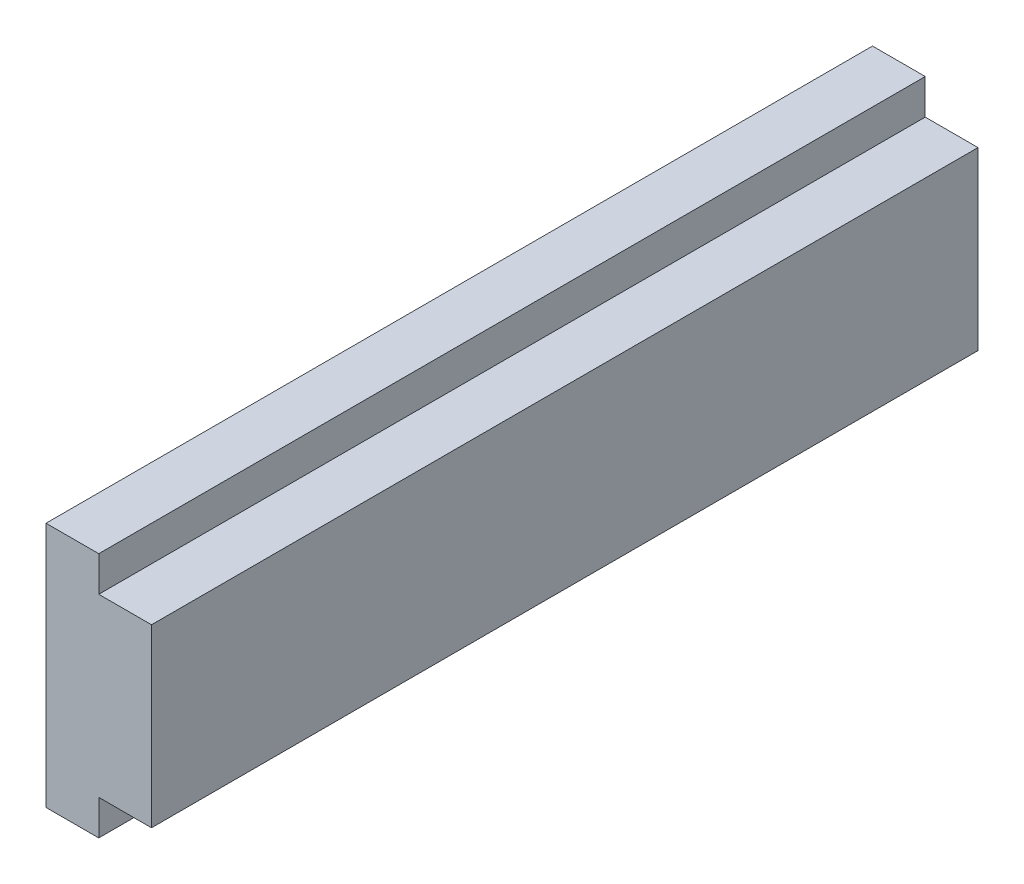
ISO-10303-21;
HEADER;
FILE_DESCRIPTION(('STEP AP214'),'2;1');
FILE_NAME('part.step','',(''),(''),'','','');
FILE_SCHEMA(('AUTOMOTIVE_DESIGN { 1 0 10303 214 1 1 1 1 }'));
ENDSEC;
DATA;
#1=APPLICATION_CONTEXT('core data for automotive mechanical design processes');
#2=APPLICATION_PROTOCOL_DEFINITION('international standard','automotive_design',2000,#1);
#3=PRODUCT_CONTEXT('',#1,'mechanical');
#4=PRODUCT('Part','Part','',(#3));
#5=PRODUCT_RELATED_PRODUCT_CATEGORY('part','',(#4));
#6=PRODUCT_DEFINITION_FORMATION('','',#4);
#7=PRODUCT_DEFINITION_CONTEXT('part definition',#1,'design');
#8=PRODUCT_DEFINITION('design','',#6,#7);
#9=PRODUCT_DEFINITION_SHAPE('','',#8);
#10=(LENGTH_UNIT() NAMED_UNIT(*) SI_UNIT(.MILLI.,.METRE.));
#11=(NAMED_UNIT(*) PLANE_ANGLE_UNIT() SI_UNIT($,.RADIAN.));
#12=(NAMED_UNIT(*) SI_UNIT($,.STERADIAN.) SOLID_ANGLE_UNIT());
#13=UNCERTAINTY_MEASURE_WITH_UNIT(LENGTH_MEASURE(1.E-05),#10,'distance_accuracy_value','');
#14=(GEOMETRIC_REPRESENTATION_CONTEXT(3) GLOBAL_UNCERTAINTY_ASSIGNED_CONTEXT((#13)) GLOBAL_UNIT_ASSIGNED_CONTEXT((#10,
#11,#12)) REPRESENTATION_CONTEXT('',''));
#15=CARTESIAN_POINT('',(0.,0.,0.));
#16=DIRECTION('',(0.,0.,1.));
#17=DIRECTION('',(1.,0.,0.));
#18=AXIS2_PLACEMENT_3D('',#15,#16,#17);
#19=CARTESIAN_POINT('',(0.,0.,47.));
#20=DIRECTION('',(0.,1.,0.));
#21=DIRECTION('',(0.,0.,1.));
#22=AXIS2_PLACEMENT_3D('',#19,#20,#21);
#23=PLANE('',#22);
#24=DIRECTION('',(1.,0.,0.));
#25=VECTOR('',#24,1.);
#26=CARTESIAN_POINT('',(0.,0.,0.));
#27=LINE('',#26,#25);
#28=CARTESIAN_POINT('',(0.,0.,0.));
#29=VERTEX_POINT('',#28);
#30=CARTESIAN_POINT('',(3.,0.,0.));
#31=VERTEX_POINT('',#30);
#32=EDGE_CURVE('E144',#29,#31,#27,.T.);
#33=ORIENTED_EDGE('',*,*,#32,.T.);
#34=DIRECTION('',(0.,0.,-1.));
#35=VECTOR('',#34,1.);
#36=CARTESIAN_POINT('',(3.,0.,47.));
#37=LINE('',#36,#35);
#38=CARTESIAN_POINT('',(3.,0.,47.));
#39=VERTEX_POINT('',#38);
#40=EDGE_CURVE('E11',#39,#31,#37,.T.);
#41=ORIENTED_EDGE('',*,*,#40,.F.);
#42=DIRECTION('',(1.,0.,0.));
#43=VECTOR('',#42,1.);
#44=CARTESIAN_POINT('',(0.,0.,47.));
#45=LINE('',#44,#43);
#46=CARTESIAN_POINT('',(0.,0.,47.));
#47=VERTEX_POINT('',#46);
#48=EDGE_CURVE('E169',#47,#39,#45,.T.);
#49=ORIENTED_EDGE('',*,*,#48,.F.);
#50=DIRECTION('',(0.,0.,-1.));
#51=VECTOR('',#50,1.);
#52=CARTESIAN_POINT('',(0.,0.,47.));
#53=LINE('',#52,#51);
#54=EDGE_CURVE('E58',#47,#29,#53,.T.);
#55=ORIENTED_EDGE('',*,*,#54,.T.);
#56=EDGE_LOOP('',(#33,#41,#49,#55));
#57=FACE_BOUND('',#56,.T.);
#58=ADVANCED_FACE('F41',(#57),#23,.F.);
#59=CARTESIAN_POINT('',(3.,0.,47.));
#60=DIRECTION('',(-1.,0.,0.));
#61=DIRECTION('',(0.,0.,1.));
#62=AXIS2_PLACEMENT_3D('',#59,#60,#61);
#63=PLANE('',#62);
#64=DIRECTION('',(0.,1.,0.));
#65=VECTOR('',#64,1.);
#66=CARTESIAN_POINT('',(3.,0.,0.));
#67=LINE('',#66,#65);
#68=CARTESIAN_POINT('',(3.,2.,0.));
#69=VERTEX_POINT('',#68);
#70=EDGE_CURVE('E147',#31,#69,#67,.T.);
#71=ORIENTED_EDGE('',*,*,#70,.T.);
#72=DIRECTION('',(0.,0.,-1.));
#73=VECTOR('',#72,1.);
#74=CARTESIAN_POINT('',(3.,2.,47.));
#75=LINE('',#74,#73);
#76=CARTESIAN_POINT('',(3.,2.,47.));
#77=VERTEX_POINT('',#76);
#78=EDGE_CURVE('E50',#77,#69,#75,.T.);
#79=ORIENTED_EDGE('',*,*,#78,.F.);
#80=DIRECTION('',(0.,1.,0.));
#81=VECTOR('',#80,1.);
#82=CARTESIAN_POINT('',(3.,0.,47.));
#83=LINE('',#82,#81);
#84=EDGE_CURVE('E96',#39,#77,#83,.T.);
#85=ORIENTED_EDGE('',*,*,#84,.F.);
#86=ORIENTED_EDGE('',*,*,#40,.T.);
#87=EDGE_LOOP('',(#71,#79,#85,#86));
#88=FACE_BOUND('',#87,.T.);
#89=ADVANCED_FACE('F205',(#88),#63,.F.);
#90=CARTESIAN_POINT('',(0.,2.,47.));
#91=DIRECTION('',(0.,1.,0.));
#92=DIRECTION('',(0.,0.,1.));
#93=AXIS2_PLACEMENT_3D('',#90,#91,#92);
#94=PLANE('',#93);
#95=DIRECTION('',(1.,0.,0.));
#96=VECTOR('',#95,1.);
#97=CARTESIAN_POINT('',(0.,2.,0.));
#98=LINE('',#97,#96);
#99=CARTESIAN_POINT('',(6.,2.,0.));
#100=VERTEX_POINT('',#99);
#101=EDGE_CURVE('E150',#69,#100,#98,.T.);
#102=ORIENTED_EDGE('',*,*,#101,.T.);
#103=DIRECTION('',(0.,0.,-1.));
#104=VECTOR('',#103,1.);
#105=CARTESIAN_POINT('',(6.,2.,47.));
#106=LINE('',#105,#104);
#107=CARTESIAN_POINT('',(6.,2.,47.));
#108=VERTEX_POINT('',#107);
#109=EDGE_CURVE('E179',#108,#100,#106,.T.);
#110=ORIENTED_EDGE('',*,*,#109,.F.);
#111=DIRECTION('',(1.,0.,0.));
#112=VECTOR('',#111,1.);
#113=CARTESIAN_POINT('',(0.,2.,47.));
#114=LINE('',#113,#112);
#115=EDGE_CURVE('E188',#77,#108,#114,.T.);
#116=ORIENTED_EDGE('',*,*,#115,.F.);
#117=ORIENTED_EDGE('',*,*,#78,.T.);
#118=EDGE_LOOP('',(#102,#110,#116,#117));
#119=FACE_BOUND('',#118,.T.);
#120=ADVANCED_FACE('F186',(#119),#94,.F.);
#121=CARTESIAN_POINT('',(6.,0.,47.));
#122=DIRECTION('',(1.,0.,0.));
#123=DIRECTION('',(0.,1.,0.));
#124=AXIS2_PLACEMENT_3D('',#121,#122,#123);
#125=PLANE('',#124);
#126=DIRECTION('',(0.,-1.,0.));
#127=VECTOR('',#126,1.);
#128=CARTESIAN_POINT('',(6.,0.,0.));
#129=LINE('',#128,#127);
#130=CARTESIAN_POINT('',(6.,12.,0.));
#131=VERTEX_POINT('',#130);
#132=EDGE_CURVE('E154',#131,#100,#129,.T.);
#133=ORIENTED_EDGE('',*,*,#132,.F.);
#134=DIRECTION('',(0.,0.,-1.));
#135=VECTOR('',#134,1.);
#136=CARTESIAN_POINT('',(6.,12.,47.));
#137=LINE('',#136,#135);
#138=CARTESIAN_POINT('',(6.,12.,47.));
#139=VERTEX_POINT('',#138);
#140=EDGE_CURVE('E176',#139,#131,#137,.T.);
#141=ORIENTED_EDGE('',*,*,#140,.F.);
#142=DIRECTION('',(0.,-1.,0.));
#143=VECTOR('',#142,1.);
#144=CARTESIAN_POINT('',(6.,0.,47.));
#145=LINE('',#144,#143);
#146=EDGE_CURVE('E196',#139,#108,#145,.T.);
#147=ORIENTED_EDGE('',*,*,#146,.T.);
#148=ORIENTED_EDGE('',*,*,#109,.T.);
#149=EDGE_LOOP('',(#133,#141,#147,#148));
#150=FACE_BOUND('',#149,.T.);
#151=ADVANCED_FACE('F194',(#150),#125,.T.);
#152=CARTESIAN_POINT('',(0.,12.,47.));
#153=DIRECTION('',(0.,1.,0.));
#154=DIRECTION('',(0.,0.,1.));
#155=AXIS2_PLACEMENT_3D('',#152,#153,#154);
#156=PLANE('',#155);
#157=DIRECTION('',(1.,0.,0.));
#158=VECTOR('',#157,1.);
#159=CARTESIAN_POINT('',(0.,12.,0.));
#160=LINE('',#159,#158);
#161=CARTESIAN_POINT('',(3.,12.,0.));
#162=VERTEX_POINT('',#161);
#163=EDGE_CURVE('E158',#162,#131,#160,.T.);
#164=ORIENTED_EDGE('',*,*,#163,.F.);
#165=DIRECTION('',(0.,0.,-1.));
#166=VECTOR('',#165,1.);
#167=CARTESIAN_POINT('',(3.,12.,47.));
#168=LINE('',#167,#166);
#169=CARTESIAN_POINT('',(3.,12.,47.));
#170=VERTEX_POINT('',#169);
#171=EDGE_CURVE('E133',#170,#162,#168,.T.);
#172=ORIENTED_EDGE('',*,*,#171,.F.);
#173=DIRECTION('',(1.,0.,0.));
#174=VECTOR('',#173,1.);
#175=CARTESIAN_POINT('',(0.,12.,47.));
#176=LINE('',#175,#174);
#177=EDGE_CURVE('E121',#170,#139,#176,.T.);
#178=ORIENTED_EDGE('',*,*,#177,.T.);
#179=ORIENTED_EDGE('',*,*,#140,.T.);
#180=EDGE_LOOP('',(#164,#172,#178,#179));
#181=FACE_BOUND('',#180,.T.);
#182=ADVANCED_FACE('F215',(#181),#156,.T.);
#183=CARTESIAN_POINT('',(3.,14.,0.));
#184=VERTEX_POINT('',#183);
#185=EDGE_CURVE('E129',#162,#184,#67,.T.);
#186=ORIENTED_EDGE('',*,*,#185,.T.);
#187=DIRECTION('',(0.,0.,-1.));
#188=VECTOR('',#187,1.);
#189=CARTESIAN_POINT('',(3.,14.,47.));
#190=LINE('',#189,#188);
#191=CARTESIAN_POINT('',(3.,14.,47.));
#192=VERTEX_POINT('',#191);
#193=EDGE_CURVE('E126',#192,#184,#190,.T.);
#194=ORIENTED_EDGE('',*,*,#193,.F.);
#195=EDGE_CURVE('E113',#170,#192,#83,.T.);
#196=ORIENTED_EDGE('',*,*,#195,.F.);
#197=ORIENTED_EDGE('',*,*,#171,.T.);
#198=EDGE_LOOP('',(#186,#194,#196,#197));
#199=FACE_BOUND('',#198,.T.);
#200=ADVANCED_FACE('F127',(#199),#63,.F.);
#201=CARTESIAN_POINT('',(0.,14.,47.));
#202=DIRECTION('',(0.,1.,0.));
#203=DIRECTION('',(0.,0.,1.));
#204=AXIS2_PLACEMENT_3D('',#201,#202,#203);
#205=PLANE('',#204);
#206=DIRECTION('',(1.,0.,0.));
#207=VECTOR('',#206,1.);
#208=CARTESIAN_POINT('',(0.,14.,0.));
#209=LINE('',#208,#207);
#210=CARTESIAN_POINT('',(0.,14.,0.));
#211=VERTEX_POINT('',#210);
#212=EDGE_CURVE('E162',#211,#184,#209,.T.);
#213=ORIENTED_EDGE('',*,*,#212,.F.);
#214=DIRECTION('',(0.,0.,-1.));
#215=VECTOR('',#214,1.);
#216=CARTESIAN_POINT('',(0.,14.,47.));
#217=LINE('',#216,#215);
#218=CARTESIAN_POINT('',(0.,14.,47.));
#219=VERTEX_POINT('',#218);
#220=EDGE_CURVE('E84',#219,#211,#217,.T.);
#221=ORIENTED_EDGE('',*,*,#220,.F.);
#222=DIRECTION('',(1.,0.,0.));
#223=VECTOR('',#222,1.);
#224=CARTESIAN_POINT('',(0.,14.,47.));
#225=LINE('',#224,#223);
#226=EDGE_CURVE('E118',#219,#192,#225,.T.);
#227=ORIENTED_EDGE('',*,*,#226,.T.);
#228=ORIENTED_EDGE('',*,*,#193,.T.);
#229=EDGE_LOOP('',(#213,#221,#227,#228));
#230=FACE_BOUND('',#229,.T.);
#231=ADVANCED_FACE('F135',(#230),#205,.T.);
#232=CARTESIAN_POINT('',(0.,0.,47.));
#233=DIRECTION('',(-1.,0.,0.));
#234=DIRECTION('',(0.,0.,1.));
#235=AXIS2_PLACEMENT_3D('',#232,#233,#234);
#236=PLANE('',#235);
#237=DIRECTION('',(0.,1.,0.));
#238=VECTOR('',#237,1.);
#239=CARTESIAN_POINT('',(0.,0.,0.));
#240=LINE('',#239,#238);
#241=EDGE_CURVE('E165',#29,#211,#240,.T.);
#242=ORIENTED_EDGE('',*,*,#241,.F.);
#243=ORIENTED_EDGE('',*,*,#54,.F.);
#244=DIRECTION('',(0.,1.,0.));
#245=VECTOR('',#244,1.);
#246=CARTESIAN_POINT('',(0.,0.,47.));
#247=LINE('',#246,#245);
#248=EDGE_CURVE('E137',#47,#219,#247,.T.);
#249=ORIENTED_EDGE('',*,*,#248,.T.);
#250=ORIENTED_EDGE('',*,*,#220,.T.);
#251=EDGE_LOOP('',(#242,#243,#249,#250));
#252=FACE_BOUND('',#251,.T.);
#253=ADVANCED_FACE('F220',(#252),#236,.T.);
#254=CARTESIAN_POINT('',(0.,0.,47.));
#255=DIRECTION('',(0.,0.,1.));
#256=DIRECTION('',(1.,0.,0.));
#257=AXIS2_PLACEMENT_3D('',#254,#255,#256);
#258=PLANE('',#257);
#259=ORIENTED_EDGE('',*,*,#48,.T.);
#260=ORIENTED_EDGE('',*,*,#84,.T.);
#261=ORIENTED_EDGE('',*,*,#115,.T.);
#262=ORIENTED_EDGE('',*,*,#146,.F.);
#263=ORIENTED_EDGE('',*,*,#177,.F.);
#264=ORIENTED_EDGE('',*,*,#195,.T.);
#265=ORIENTED_EDGE('',*,*,#226,.F.);
#266=ORIENTED_EDGE('',*,*,#248,.F.);
#267=EDGE_LOOP('',(#259,#260,#261,#262,#263,#264,#265,#266));
#268=FACE_BOUND('',#267,.T.);
#269=ADVANCED_FACE('F115',(#268),#258,.T.);
#270=CARTESIAN_POINT('',(0.,0.,0.));
#271=DIRECTION('',(0.,0.,1.));
#272=DIRECTION('',(1.,0.,0.));
#273=AXIS2_PLACEMENT_3D('',#270,#271,#272);
#274=PLANE('',#273);
#275=ORIENTED_EDGE('',*,*,#32,.F.);
#276=ORIENTED_EDGE('',*,*,#241,.T.);
#277=ORIENTED_EDGE('',*,*,#212,.T.);
#278=ORIENTED_EDGE('',*,*,#185,.F.);
#279=ORIENTED_EDGE('',*,*,#163,.T.);
#280=ORIENTED_EDGE('',*,*,#132,.T.);
#281=ORIENTED_EDGE('',*,*,#101,.F.);
#282=ORIENTED_EDGE('',*,*,#70,.F.);
#283=EDGE_LOOP('',(#275,#276,#277,#278,#279,#280,#281,#282));
#284=FACE_BOUND('',#283,.T.);
#285=ADVANCED_FACE('F190',(#284),#274,.F.);
#286=CLOSED_SHELL('',(#58,#89,#120,#151,#182,#200,#231,#253,#269,#285));
#287=MANIFOLD_SOLID_BREP('B2',#286);
#288=ADVANCED_BREP_SHAPE_REPRESENTATION('',(#18,#287),#14);
#289=SHAPE_DEFINITION_REPRESENTATION(#9,#288);
ENDSEC;
END-ISO-10303-21;
